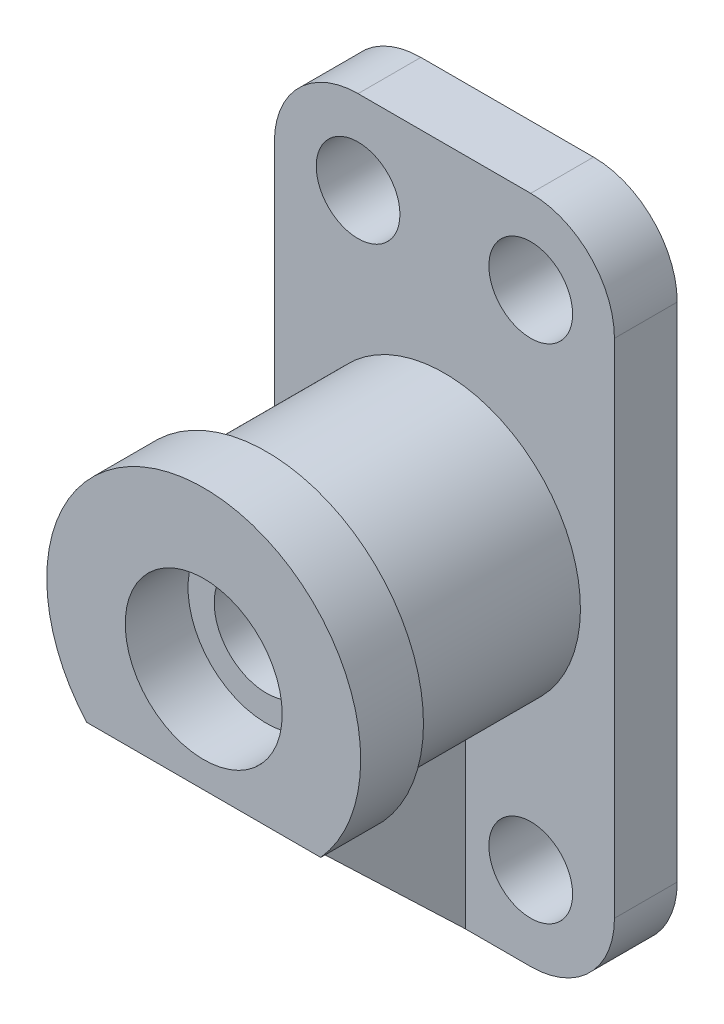
ISO-10303-21;
HEADER;
FILE_DESCRIPTION(('STEP AP214'),'2;1');
FILE_NAME('part.step','',(''),(''),'','','');
FILE_SCHEMA(('AUTOMOTIVE_DESIGN { 1 0 10303 214 1 1 1 1 }'));
ENDSEC;
DATA;
#1=APPLICATION_CONTEXT('core data for automotive mechanical design processes');
#2=APPLICATION_PROTOCOL_DEFINITION('international standard','automotive_design',2000,#1);
#3=PRODUCT_CONTEXT('',#1,'mechanical');
#4=PRODUCT('Part','Part','',(#3));
#5=PRODUCT_RELATED_PRODUCT_CATEGORY('part','',(#4));
#6=PRODUCT_DEFINITION_FORMATION('','',#4);
#7=PRODUCT_DEFINITION_CONTEXT('part definition',#1,'design');
#8=PRODUCT_DEFINITION('design','',#6,#7);
#9=PRODUCT_DEFINITION_SHAPE('','',#8);
#10=(LENGTH_UNIT() NAMED_UNIT(*) SI_UNIT(.MILLI.,.METRE.));
#11=(NAMED_UNIT(*) PLANE_ANGLE_UNIT() SI_UNIT($,.RADIAN.));
#12=(NAMED_UNIT(*) SI_UNIT($,.STERADIAN.) SOLID_ANGLE_UNIT());
#13=UNCERTAINTY_MEASURE_WITH_UNIT(LENGTH_MEASURE(1.E-05),#10,'distance_accuracy_value','');
#14=(GEOMETRIC_REPRESENTATION_CONTEXT(3) GLOBAL_UNCERTAINTY_ASSIGNED_CONTEXT((#13)) GLOBAL_UNIT_ASSIGNED_CONTEXT((#10,
#11,#12)) REPRESENTATION_CONTEXT('',''));
#15=CARTESIAN_POINT('',(0.,0.,0.));
#16=DIRECTION('',(0.,0.,1.));
#17=DIRECTION('',(1.,0.,0.));
#18=AXIS2_PLACEMENT_3D('',#15,#16,#17);
#19=CARTESIAN_POINT('',(-75.0284068949451,14.3133089873143,12.));
#20=DIRECTION('',(0.,1.,0.));
#21=DIRECTION('',(0.,0.,1.));
#22=AXIS2_PLACEMENT_3D('',#19,#20,#21);
#23=PLANE('',#22);
#24=DIRECTION('',(0.,0.,1.));
#25=VECTOR('',#24,1.);
#26=CARTESIAN_POINT('',(-48.6677271199472,14.3133089873143,12.));
#27=LINE('',#26,#25);
#28=CARTESIAN_POINT('',(-48.6677271199472,14.3133089873143,12.));
#29=VERTEX_POINT('',#28);
#30=CARTESIAN_POINT('',(-48.6677271199472,14.3133089873143,58.));
#31=VERTEX_POINT('',#30);
#32=EDGE_CURVE('E54',#29,#31,#27,.T.);
#33=ORIENTED_EDGE('',*,*,#32,.F.);
#34=DIRECTION('',(-1.,0.,0.));
#35=VECTOR('',#34,1.);
#36=CARTESIAN_POINT('',(-75.0284068949451,14.3133089873143,12.));
#37=LINE('',#36,#35);
#38=CARTESIAN_POINT('',(-36.0544793941111,14.3133089873143,12.));
#39=VERTEX_POINT('',#38);
#40=EDGE_CURVE('E194',#39,#29,#37,.T.);
#41=ORIENTED_EDGE('',*,*,#40,.F.);
#42=DIRECTION('',(0.,0.,-1.));
#43=VECTOR('',#42,1.);
#44=CARTESIAN_POINT('',(-36.0544793941111,14.3133089873143,46.));
#45=LINE('',#44,#43);
#46=CARTESIAN_POINT('',(-36.0544793941111,14.3133089873143,46.));
#47=VERTEX_POINT('',#46);
#48=EDGE_CURVE('E201',#47,#39,#45,.T.);
#49=ORIENTED_EDGE('',*,*,#48,.F.);
#50=DIRECTION('',(-1.,0.,0.));
#51=VECTOR('',#50,1.);
#52=CARTESIAN_POINT('',(-52.6677271199472,14.3133089873143,46.));
#53=LINE('',#52,#51);
#54=CARTESIAN_POINT('',(-30.3070473449493,14.3133089873143,46.));
#55=VERTEX_POINT('',#54);
#56=EDGE_CURVE('E196',#55,#47,#53,.T.);
#57=ORIENTED_EDGE('',*,*,#56,.F.);
#58=DIRECTION('',(0.,0.,-1.));
#59=VECTOR('',#58,1.);
#60=CARTESIAN_POINT('',(-30.3070473449493,14.3133089873143,58.));
#61=LINE('',#60,#59);
#62=CARTESIAN_POINT('',(-30.3070473449493,14.3133089873143,58.));
#63=VERTEX_POINT('',#62);
#64=EDGE_CURVE('E157',#63,#55,#61,.T.);
#65=ORIENTED_EDGE('',*,*,#64,.F.);
#66=DIRECTION('',(-1.,0.,0.));
#67=VECTOR('',#66,1.);
#68=CARTESIAN_POINT('',(-75.0284068949451,14.3133089873143,58.));
#69=LINE('',#68,#67);
#70=EDGE_CURVE('E153',#63,#31,#69,.T.);
#71=ORIENTED_EDGE('',*,*,#70,.T.);
#72=EDGE_LOOP('',(#33,#41,#49,#57,#65,#71));
#73=FACE_BOUND('',#72,.T.);
#74=ADVANCED_FACE('F45',(#73),#23,.F.);
#75=CARTESIAN_POINT('',(-52.6677271199472,34.3133089873143,46.));
#76=DIRECTION('',(0.,0.,1.));
#77=DIRECTION('',(1.,0.,0.));
#78=AXIS2_PLACEMENT_3D('',#75,#76,#77);
#79=PLANE('',#78);
#80=CARTESIAN_POINT('',(-52.6677271199472,34.3133089873143,46.));
#81=DIRECTION('',(0.,0.,1.));
#82=DIRECTION('',(1.,0.,0.));
#83=AXIS2_PLACEMENT_3D('',#80,#81,#82);
#84=CIRCLE('',#83,10.);
#85=CARTESIAN_POINT('',(-42.6677271199472,34.3133089873143,46.));
#86=VERTEX_POINT('',#85);
#87=EDGE_CURVE('E225',#86,#86,#84,.T.);
#88=ORIENTED_EDGE('',*,*,#87,.F.);
#89=EDGE_LOOP('',(#88));
#90=FACE_BOUND('',#89,.T.);
#91=CARTESIAN_POINT('',(-52.6677271199472,34.3133089873143,46.));
#92=DIRECTION('',(0.,0.,1.));
#93=DIRECTION('',(1.,0.,0.));
#94=AXIS2_PLACEMENT_3D('',#91,#92,#93);
#95=CIRCLE('',#94,15.);
#96=CARTESIAN_POINT('',(-37.6677271199472,34.3133089873143,46.));
#97=VERTEX_POINT('',#96);
#98=EDGE_CURVE('E210',#97,#97,#95,.T.);
#99=ORIENTED_EDGE('',*,*,#98,.T.);
#100=EDGE_LOOP('',(#99));
#101=FACE_BOUND('',#100,.T.);
#102=ADVANCED_FACE('F429',(#90,#101),#79,.T.);
#103=CARTESIAN_POINT('',(-69.1677271199472,82.3133089873143,12.));
#104=DIRECTION('',(0.,0.,1.));
#105=DIRECTION('',(1.,0.,0.));
#106=AXIS2_PLACEMENT_3D('',#103,#104,#105);
#107=PLANE('',#106);
#108=CARTESIAN_POINT('',(-56.6677271199472,14.3133089873143,12.));
#109=VERTEX_POINT('',#108);
#110=CARTESIAN_POINT('',(-69.2809748457834,14.3133089873143,12.));
#111=VERTEX_POINT('',#110);
#112=EDGE_CURVE('E161',#109,#111,#37,.T.);
#113=ORIENTED_EDGE('',*,*,#112,.T.);
#114=CARTESIAN_POINT('',(-52.6677271199472,34.3133089873143,12.));
#115=DIRECTION('',(0.,0.,1.));
#116=DIRECTION('',(1.,0.,0.));
#117=AXIS2_PLACEMENT_3D('',#114,#115,#116);
#118=CIRCLE('',#117,26.);
#119=EDGE_CURVE('E229',#39,#111,#118,.T.);
#120=ORIENTED_EDGE('',*,*,#119,.F.);
#121=ORIENTED_EDGE('',*,*,#40,.T.);
#122=DIRECTION('',(0.,-1.,0.));
#123=VECTOR('',#122,1.);
#124=CARTESIAN_POINT('',(-48.6677271199472,82.3133089873143,12.));
#125=LINE('',#124,#123);
#126=CARTESIAN_POINT('',(-48.6677271199472,-29.6866910126857,12.));
#127=VERTEX_POINT('',#126);
#128=EDGE_CURVE('E61',#29,#127,#125,.T.);
#129=ORIENTED_EDGE('',*,*,#128,.T.);
#130=DIRECTION('',(1.,0.,0.));
#131=VECTOR('',#130,1.);
#132=CARTESIAN_POINT('',(-36.1677271199472,-29.6866910126856,12.));
#133=LINE('',#132,#131);
#134=CARTESIAN_POINT('',(-36.1677271199472,-29.6866910126856,12.));
#135=VERTEX_POINT('',#134);
#136=EDGE_CURVE('E279',#127,#135,#133,.T.);
#137=ORIENTED_EDGE('',*,*,#136,.T.);
#138=CARTESIAN_POINT('',(-36.1677271199472,-13.6866910126856,12.));
#139=DIRECTION('',(0.,0.,1.));
#140=DIRECTION('',(1.,0.,0.));
#141=AXIS2_PLACEMENT_3D('',#138,#139,#140);
#142=CIRCLE('',#141,16.);
#143=CARTESIAN_POINT('',(-20.1677271199472,-13.6866910126856,12.));
#144=VERTEX_POINT('',#143);
#145=EDGE_CURVE('E283',#135,#144,#142,.T.);
#146=ORIENTED_EDGE('',*,*,#145,.T.);
#147=DIRECTION('',(0.,1.,0.));
#148=VECTOR('',#147,1.);
#149=CARTESIAN_POINT('',(-20.1677271199472,82.3133089873143,12.));
#150=LINE('',#149,#148);
#151=CARTESIAN_POINT('',(-20.1677271199472,82.3133089873143,12.));
#152=VERTEX_POINT('',#151);
#153=EDGE_CURVE('E286',#144,#152,#150,.T.);
#154=ORIENTED_EDGE('',*,*,#153,.T.);
#155=CARTESIAN_POINT('',(-36.1677271199472,82.3133089873143,12.));
#156=DIRECTION('',(0.,0.,1.));
#157=DIRECTION('',(1.,0.,0.));
#158=AXIS2_PLACEMENT_3D('',#155,#156,#157);
#159=CIRCLE('',#158,16.);
#160=CARTESIAN_POINT('',(-36.1677271199472,98.3133089873143,12.));
#161=VERTEX_POINT('',#160);
#162=EDGE_CURVE('E289',#152,#161,#159,.T.);
#163=ORIENTED_EDGE('',*,*,#162,.T.);
#164=DIRECTION('',(-1.,0.,0.));
#165=VECTOR('',#164,1.);
#166=CARTESIAN_POINT('',(-69.1677271199472,98.3133089873143,12.));
#167=LINE('',#166,#165);
#168=CARTESIAN_POINT('',(-69.1677271199472,98.3133089873143,12.));
#169=VERTEX_POINT('',#168);
#170=EDGE_CURVE('E292',#161,#169,#167,.T.);
#171=ORIENTED_EDGE('',*,*,#170,.T.);
#172=CARTESIAN_POINT('',(-69.1677271199472,82.3133089873143,12.));
#173=DIRECTION('',(0.,0.,1.));
#174=DIRECTION('',(1.,0.,0.));
#175=AXIS2_PLACEMENT_3D('',#172,#173,#174);
#176=CIRCLE('',#175,16.);
#177=CARTESIAN_POINT('',(-85.1677271199472,82.3133089873143,12.));
#178=VERTEX_POINT('',#177);
#179=EDGE_CURVE('E268',#169,#178,#176,.T.);
#180=ORIENTED_EDGE('',*,*,#179,.T.);
#181=DIRECTION('',(0.,-1.,0.));
#182=VECTOR('',#181,1.);
#183=CARTESIAN_POINT('',(-85.1677271199472,82.3133089873143,12.));
#184=LINE('',#183,#182);
#185=CARTESIAN_POINT('',(-85.1677271199472,-13.6866910126857,12.));
#186=VERTEX_POINT('',#185);
#187=EDGE_CURVE('E272',#178,#186,#184,.T.);
#188=ORIENTED_EDGE('',*,*,#187,.T.);
#189=CARTESIAN_POINT('',(-69.1677271199472,-13.6866910126857,12.));
#190=DIRECTION('',(0.,0.,1.));
#191=DIRECTION('',(1.,0.,0.));
#192=AXIS2_PLACEMENT_3D('',#189,#190,#191);
#193=CIRCLE('',#192,16.);
#194=CARTESIAN_POINT('',(-69.1677271199472,-29.6866910126857,12.));
#195=VERTEX_POINT('',#194);
#196=EDGE_CURVE('E276',#186,#195,#193,.T.);
#197=ORIENTED_EDGE('',*,*,#196,.T.);
#198=CARTESIAN_POINT('',(-56.6677271199472,-29.6866910126857,12.));
#199=VERTEX_POINT('',#198);
#200=EDGE_CURVE('E280',#195,#199,#133,.T.);
#201=ORIENTED_EDGE('',*,*,#200,.T.);
#202=DIRECTION('',(0.,-1.,0.));
#203=VECTOR('',#202,1.);
#204=CARTESIAN_POINT('',(-56.6677271199472,82.3133089873143,12.));
#205=LINE('',#204,#203);
#206=EDGE_CURVE('E188',#109,#199,#205,.T.);
#207=ORIENTED_EDGE('',*,*,#206,.F.);
#208=EDGE_LOOP('',(#113,#120,#121,#129,#137,#146,#154,#163,#171,#180,#188,#197,#201,#207));
#209=FACE_BOUND('',#208,.T.);
#210=CARTESIAN_POINT('',(-69.1677271199472,-13.6866910126857,12.));
#211=DIRECTION('',(0.,0.,1.));
#212=DIRECTION('',(1.,0.,0.));
#213=AXIS2_PLACEMENT_3D('',#210,#211,#212);
#214=CIRCLE('',#213,8.);
#215=CARTESIAN_POINT('',(-61.1677271199472,-13.6866910126857,12.));
#216=VERTEX_POINT('',#215);
#217=EDGE_CURVE('E244',#216,#216,#214,.T.);
#218=ORIENTED_EDGE('',*,*,#217,.F.);
#219=EDGE_LOOP('',(#218));
#220=FACE_BOUND('',#219,.T.);
#221=CARTESIAN_POINT('',(-69.1677271199472,82.3133089873143,12.));
#222=DIRECTION('',(0.,0.,1.));
#223=DIRECTION('',(1.,0.,0.));
#224=AXIS2_PLACEMENT_3D('',#221,#222,#223);
#225=CIRCLE('',#224,8.);
#226=CARTESIAN_POINT('',(-61.1677271199472,82.3133089873143,12.));
#227=VERTEX_POINT('',#226);
#228=EDGE_CURVE('E260',#227,#227,#225,.T.);
#229=ORIENTED_EDGE('',*,*,#228,.F.);
#230=EDGE_LOOP('',(#229));
#231=FACE_BOUND('',#230,.T.);
#232=CARTESIAN_POINT('',(-36.1677271199472,-13.6866910126856,12.));
#233=DIRECTION('',(0.,0.,1.));
#234=DIRECTION('',(1.,0.,0.));
#235=AXIS2_PLACEMENT_3D('',#232,#233,#234);
#236=CIRCLE('',#235,8.);
#237=CARTESIAN_POINT('',(-28.1677271199472,-13.6866910126856,12.));
#238=VERTEX_POINT('',#237);
#239=EDGE_CURVE('E236',#238,#238,#236,.T.);
#240=ORIENTED_EDGE('',*,*,#239,.F.);
#241=EDGE_LOOP('',(#240));
#242=FACE_BOUND('',#241,.T.);
#243=CARTESIAN_POINT('',(-36.1677271199472,82.3133089873143,12.));
#244=DIRECTION('',(0.,0.,1.));
#245=DIRECTION('',(1.,0.,0.));
#246=AXIS2_PLACEMENT_3D('',#243,#244,#245);
#247=CIRCLE('',#246,8.);
#248=CARTESIAN_POINT('',(-28.1677271199472,82.3133089873143,12.));
#249=VERTEX_POINT('',#248);
#250=EDGE_CURVE('E252',#249,#249,#247,.T.);
#251=ORIENTED_EDGE('',*,*,#250,.F.);
#252=EDGE_LOOP('',(#251));
#253=FACE_BOUND('',#252,.T.);
#254=ADVANCED_FACE('F378',(#209,#220,#231,#242,#253),#107,.T.);
#255=CARTESIAN_POINT('',(-69.1677271199472,82.3133089873143,0.));
#256=DIRECTION('',(0.,0.,1.));
#257=DIRECTION('',(1.,0.,0.));
#258=AXIS2_PLACEMENT_3D('',#255,#256,#257);
#259=PLANE('',#258);
#260=CARTESIAN_POINT('',(-52.6677271199472,34.3133089873143,0.));
#261=DIRECTION('',(0.,0.,1.));
#262=DIRECTION('',(1.,0.,0.));
#263=AXIS2_PLACEMENT_3D('',#260,#261,#262);
#264=CIRCLE('',#263,10.);
#265=CARTESIAN_POINT('',(-42.6677271199472,34.3133089873143,0.));
#266=VERTEX_POINT('',#265);
#267=EDGE_CURVE('E222',#266,#266,#264,.T.);
#268=ORIENTED_EDGE('',*,*,#267,.T.);
#269=EDGE_LOOP('',(#268));
#270=FACE_BOUND('',#269,.T.);
#271=CARTESIAN_POINT('',(-69.1677271199472,82.3133089873143,0.));
#272=DIRECTION('',(0.,0.,1.));
#273=DIRECTION('',(1.,0.,0.));
#274=AXIS2_PLACEMENT_3D('',#271,#272,#273);
#275=CIRCLE('',#274,16.);
#276=CARTESIAN_POINT('',(-69.1677271199472,98.3133089873143,0.));
#277=VERTEX_POINT('',#276);
#278=CARTESIAN_POINT('',(-85.1677271199472,82.3133089873143,0.));
#279=VERTEX_POINT('',#278);
#280=EDGE_CURVE('E264',#277,#279,#275,.T.);
#281=ORIENTED_EDGE('',*,*,#280,.F.);
#282=DIRECTION('',(-1.,0.,0.));
#283=VECTOR('',#282,1.);
#284=CARTESIAN_POINT('',(-69.1677271199472,98.3133089873143,0.));
#285=LINE('',#284,#283);
#286=CARTESIAN_POINT('',(-36.1677271199472,98.3133089873143,0.));
#287=VERTEX_POINT('',#286);
#288=EDGE_CURVE('E273',#287,#277,#285,.T.);
#289=ORIENTED_EDGE('',*,*,#288,.F.);
#290=CARTESIAN_POINT('',(-36.1677271199472,82.3133089873143,0.));
#291=DIRECTION('',(0.,0.,1.));
#292=DIRECTION('',(1.,0.,0.));
#293=AXIS2_PLACEMENT_3D('',#290,#291,#292);
#294=CIRCLE('',#293,16.);
#295=CARTESIAN_POINT('',(-20.1677271199472,82.3133089873143,0.));
#296=VERTEX_POINT('',#295);
#297=EDGE_CURVE('E314',#296,#287,#294,.T.);
#298=ORIENTED_EDGE('',*,*,#297,.F.);
#299=DIRECTION('',(0.,1.,0.));
#300=VECTOR('',#299,1.);
#301=CARTESIAN_POINT('',(-20.1677271199472,82.3133089873143,0.));
#302=LINE('',#301,#300);
#303=CARTESIAN_POINT('',(-20.1677271199472,-13.6866910126856,0.));
#304=VERTEX_POINT('',#303);
#305=EDGE_CURVE('E311',#304,#296,#302,.T.);
#306=ORIENTED_EDGE('',*,*,#305,.F.);
#307=CARTESIAN_POINT('',(-36.1677271199472,-13.6866910126856,0.));
#308=DIRECTION('',(0.,0.,1.));
#309=DIRECTION('',(1.,0.,0.));
#310=AXIS2_PLACEMENT_3D('',#307,#308,#309);
#311=CIRCLE('',#310,16.);
#312=CARTESIAN_POINT('',(-36.1677271199472,-29.6866910126856,0.));
#313=VERTEX_POINT('',#312);
#314=EDGE_CURVE('E308',#313,#304,#311,.T.);
#315=ORIENTED_EDGE('',*,*,#314,.F.);
#316=DIRECTION('',(1.,0.,0.));
#317=VECTOR('',#316,1.);
#318=CARTESIAN_POINT('',(-36.1677271199472,-29.6866910126856,0.));
#319=LINE('',#318,#317);
#320=CARTESIAN_POINT('',(-69.1677271199472,-29.6866910126857,0.));
#321=VERTEX_POINT('',#320);
#322=EDGE_CURVE('E305',#321,#313,#319,.T.);
#323=ORIENTED_EDGE('',*,*,#322,.F.);
#324=CARTESIAN_POINT('',(-69.1677271199472,-13.6866910126857,0.));
#325=DIRECTION('',(0.,0.,1.));
#326=DIRECTION('',(1.,0.,0.));
#327=AXIS2_PLACEMENT_3D('',#324,#325,#326);
#328=CIRCLE('',#327,16.);
#329=CARTESIAN_POINT('',(-85.1677271199472,-13.6866910126857,0.));
#330=VERTEX_POINT('',#329);
#331=EDGE_CURVE('E302',#330,#321,#328,.T.);
#332=ORIENTED_EDGE('',*,*,#331,.F.);
#333=DIRECTION('',(0.,-1.,0.));
#334=VECTOR('',#333,1.);
#335=CARTESIAN_POINT('',(-85.1677271199472,82.3133089873143,0.));
#336=LINE('',#335,#334);
#337=EDGE_CURVE('E299',#279,#330,#336,.T.);
#338=ORIENTED_EDGE('',*,*,#337,.F.);
#339=EDGE_LOOP('',(#281,#289,#298,#306,#315,#323,#332,#338));
#340=FACE_BOUND('',#339,.T.);
#341=CARTESIAN_POINT('',(-69.1677271199472,82.3133089873143,0.));
#342=DIRECTION('',(0.,0.,1.));
#343=DIRECTION('',(1.,0.,0.));
#344=AXIS2_PLACEMENT_3D('',#341,#342,#343);
#345=CIRCLE('',#344,8.);
#346=CARTESIAN_POINT('',(-61.1677271199472,82.3133089873143,0.));
#347=VERTEX_POINT('',#346);
#348=EDGE_CURVE('E256',#347,#347,#345,.T.);
#349=ORIENTED_EDGE('',*,*,#348,.T.);
#350=EDGE_LOOP('',(#349));
#351=FACE_BOUND('',#350,.T.);
#352=CARTESIAN_POINT('',(-69.1677271199472,-13.6866910126857,0.));
#353=DIRECTION('',(0.,0.,1.));
#354=DIRECTION('',(1.,0.,0.));
#355=AXIS2_PLACEMENT_3D('',#352,#353,#354);
#356=CIRCLE('',#355,8.);
#357=CARTESIAN_POINT('',(-61.1677271199472,-13.6866910126857,0.));
#358=VERTEX_POINT('',#357);
#359=EDGE_CURVE('E240',#358,#358,#356,.T.);
#360=ORIENTED_EDGE('',*,*,#359,.T.);
#361=EDGE_LOOP('',(#360));
#362=FACE_BOUND('',#361,.T.);
#363=CARTESIAN_POINT('',(-36.1677271199472,-13.6866910126856,0.));
#364=DIRECTION('',(0.,0.,1.));
#365=DIRECTION('',(1.,0.,0.));
#366=AXIS2_PLACEMENT_3D('',#363,#364,#365);
#367=CIRCLE('',#366,8.);
#368=CARTESIAN_POINT('',(-28.1677271199472,-13.6866910126856,0.));
#369=VERTEX_POINT('',#368);
#370=EDGE_CURVE('E233',#369,#369,#367,.T.);
#371=ORIENTED_EDGE('',*,*,#370,.T.);
#372=EDGE_LOOP('',(#371));
#373=FACE_BOUND('',#372,.T.);
#374=CARTESIAN_POINT('',(-36.1677271199472,82.3133089873143,0.));
#375=DIRECTION('',(0.,0.,1.));
#376=DIRECTION('',(1.,0.,0.));
#377=AXIS2_PLACEMENT_3D('',#374,#375,#376);
#378=CIRCLE('',#377,8.);
#379=CARTESIAN_POINT('',(-28.1677271199472,82.3133089873143,0.));
#380=VERTEX_POINT('',#379);
#381=EDGE_CURVE('E248',#380,#380,#378,.T.);
#382=ORIENTED_EDGE('',*,*,#381,.T.);
#383=EDGE_LOOP('',(#382));
#384=FACE_BOUND('',#383,.T.);
#385=ADVANCED_FACE('F391',(#270,#340,#351,#362,#373,#384),#259,.F.);
#386=CARTESIAN_POINT('',(-69.1677271199472,82.3133089873143,12.));
#387=DIRECTION('',(0.,0.,-1.));
#388=DIRECTION('',(-1.,0.,0.));
#389=AXIS2_PLACEMENT_3D('',#386,#387,#388);
#390=CYLINDRICAL_SURFACE('',#389,16.);
#391=ORIENTED_EDGE('',*,*,#280,.T.);
#392=DIRECTION('',(0.,0.,-1.));
#393=VECTOR('',#392,1.);
#394=CARTESIAN_POINT('',(-85.1677271199472,82.3133089873143,12.));
#395=LINE('',#394,#393);
#396=EDGE_CURVE('E346',#178,#279,#395,.T.);
#397=ORIENTED_EDGE('',*,*,#396,.F.);
#398=ORIENTED_EDGE('',*,*,#179,.F.);
#399=DIRECTION('',(0.,0.,-1.));
#400=VECTOR('',#399,1.);
#401=CARTESIAN_POINT('',(-69.1677271199472,98.3133089873143,12.));
#402=LINE('',#401,#400);
#403=EDGE_CURVE('E295',#169,#277,#402,.T.);
#404=ORIENTED_EDGE('',*,*,#403,.T.);
#405=EDGE_LOOP('',(#391,#397,#398,#404));
#406=FACE_BOUND('',#405,.T.);
#407=ADVANCED_FACE('F47',(#406),#390,.T.);
#408=CARTESIAN_POINT('',(-85.1677271199472,82.3133089873143,12.));
#409=DIRECTION('',(1.,0.,0.));
#410=DIRECTION('',(0.,0.,-1.));
#411=AXIS2_PLACEMENT_3D('',#408,#409,#410);
#412=PLANE('',#411);
#413=ORIENTED_EDGE('',*,*,#337,.T.);
#414=DIRECTION('',(0.,0.,-1.));
#415=VECTOR('',#414,1.);
#416=CARTESIAN_POINT('',(-85.1677271199472,-13.6866910126857,12.));
#417=LINE('',#416,#415);
#418=EDGE_CURVE('E342',#186,#330,#417,.T.);
#419=ORIENTED_EDGE('',*,*,#418,.F.);
#420=ORIENTED_EDGE('',*,*,#187,.F.);
#421=ORIENTED_EDGE('',*,*,#396,.T.);
#422=EDGE_LOOP('',(#413,#419,#420,#421));
#423=FACE_BOUND('',#422,.T.);
#424=ADVANCED_FACE('F418',(#423),#412,.F.);
#425=CARTESIAN_POINT('',(-69.1677271199472,-13.6866910126857,12.));
#426=DIRECTION('',(0.,0.,-1.));
#427=DIRECTION('',(-1.,0.,0.));
#428=AXIS2_PLACEMENT_3D('',#425,#426,#427);
#429=CYLINDRICAL_SURFACE('',#428,16.);
#430=ORIENTED_EDGE('',*,*,#331,.T.);
#431=DIRECTION('',(0.,0.,-1.));
#432=VECTOR('',#431,1.);
#433=CARTESIAN_POINT('',(-69.1677271199472,-29.6866910126857,12.));
#434=LINE('',#433,#432);
#435=EDGE_CURVE('E338',#195,#321,#434,.T.);
#436=ORIENTED_EDGE('',*,*,#435,.F.);
#437=ORIENTED_EDGE('',*,*,#196,.F.);
#438=ORIENTED_EDGE('',*,*,#418,.T.);
#439=EDGE_LOOP('',(#430,#436,#437,#438));
#440=FACE_BOUND('',#439,.T.);
#441=ADVANCED_FACE('F419',(#440),#429,.T.);
#442=CARTESIAN_POINT('',(-36.1677271199472,-29.6866910126856,12.));
#443=DIRECTION('',(0.,1.,0.));
#444=DIRECTION('',(-1.,0.,0.));
#445=AXIS2_PLACEMENT_3D('',#442,#443,#444);
#446=PLANE('',#445);
#447=ORIENTED_EDGE('',*,*,#322,.T.);
#448=DIRECTION('',(0.,0.,-1.));
#449=VECTOR('',#448,1.);
#450=CARTESIAN_POINT('',(-36.1677271199472,-29.6866910126856,12.));
#451=LINE('',#450,#449);
#452=EDGE_CURVE('E334',#135,#313,#451,.T.);
#453=ORIENTED_EDGE('',*,*,#452,.F.);
#454=ORIENTED_EDGE('',*,*,#136,.F.);
#455=DIRECTION('',(-1.,0.,0.));
#456=VECTOR('',#455,1.);
#457=CARTESIAN_POINT('',(-36.1677271199472,-29.6866910126856,12.));
#458=LINE('',#457,#456);
#459=EDGE_CURVE('E68',#199,#127,#458,.F.);
#460=ORIENTED_EDGE('',*,*,#459,.F.);
#461=ORIENTED_EDGE('',*,*,#200,.F.);
#462=ORIENTED_EDGE('',*,*,#435,.T.);
#463=EDGE_LOOP('',(#447,#453,#454,#460,#461,#462));
#464=FACE_BOUND('',#463,.T.);
#465=ADVANCED_FACE('F383',(#464),#446,.F.);
#466=CARTESIAN_POINT('',(-36.1677271199472,-13.6866910126856,12.));
#467=DIRECTION('',(0.,0.,-1.));
#468=DIRECTION('',(-1.,0.,0.));
#469=AXIS2_PLACEMENT_3D('',#466,#467,#468);
#470=CYLINDRICAL_SURFACE('',#469,16.);
#471=ORIENTED_EDGE('',*,*,#314,.T.);
#472=DIRECTION('',(0.,0.,-1.));
#473=VECTOR('',#472,1.);
#474=CARTESIAN_POINT('',(-20.1677271199472,-13.6866910126856,12.));
#475=LINE('',#474,#473);
#476=EDGE_CURVE('E330',#144,#304,#475,.T.);
#477=ORIENTED_EDGE('',*,*,#476,.F.);
#478=ORIENTED_EDGE('',*,*,#145,.F.);
#479=ORIENTED_EDGE('',*,*,#452,.T.);
#480=EDGE_LOOP('',(#471,#477,#478,#479));
#481=FACE_BOUND('',#480,.T.);
#482=ADVANCED_FACE('F397',(#481),#470,.T.);
#483=CARTESIAN_POINT('',(-20.1677271199472,82.3133089873143,12.));
#484=DIRECTION('',(-1.,0.,0.));
#485=DIRECTION('',(0.,0.,1.));
#486=AXIS2_PLACEMENT_3D('',#483,#484,#485);
#487=PLANE('',#486);
#488=ORIENTED_EDGE('',*,*,#305,.T.);
#489=DIRECTION('',(0.,0.,-1.));
#490=VECTOR('',#489,1.);
#491=CARTESIAN_POINT('',(-20.1677271199472,82.3133089873143,12.));
#492=LINE('',#491,#490);
#493=EDGE_CURVE('E326',#152,#296,#492,.T.);
#494=ORIENTED_EDGE('',*,*,#493,.F.);
#495=ORIENTED_EDGE('',*,*,#153,.F.);
#496=ORIENTED_EDGE('',*,*,#476,.T.);
#497=EDGE_LOOP('',(#488,#494,#495,#496));
#498=FACE_BOUND('',#497,.T.);
#499=ADVANCED_FACE('F401',(#498),#487,.F.);
#500=CARTESIAN_POINT('',(-36.1677271199472,82.3133089873143,12.));
#501=DIRECTION('',(0.,0.,-1.));
#502=DIRECTION('',(-1.,0.,0.));
#503=AXIS2_PLACEMENT_3D('',#500,#501,#502);
#504=CYLINDRICAL_SURFACE('',#503,16.);
#505=ORIENTED_EDGE('',*,*,#297,.T.);
#506=DIRECTION('',(0.,0.,-1.));
#507=VECTOR('',#506,1.);
#508=CARTESIAN_POINT('',(-36.1677271199472,98.3133089873143,12.));
#509=LINE('',#508,#507);
#510=EDGE_CURVE('E322',#161,#287,#509,.T.);
#511=ORIENTED_EDGE('',*,*,#510,.F.);
#512=ORIENTED_EDGE('',*,*,#162,.F.);
#513=ORIENTED_EDGE('',*,*,#493,.T.);
#514=EDGE_LOOP('',(#505,#511,#512,#513));
#515=FACE_BOUND('',#514,.T.);
#516=ADVANCED_FACE('F409',(#515),#504,.T.);
#517=CARTESIAN_POINT('',(-69.1677271199472,98.3133089873143,12.));
#518=DIRECTION('',(0.,-1.,0.));
#519=DIRECTION('',(0.,0.,-1.));
#520=AXIS2_PLACEMENT_3D('',#517,#518,#519);
#521=PLANE('',#520);
#522=ORIENTED_EDGE('',*,*,#403,.F.);
#523=ORIENTED_EDGE('',*,*,#170,.F.);
#524=ORIENTED_EDGE('',*,*,#510,.T.);
#525=ORIENTED_EDGE('',*,*,#288,.T.);
#526=EDGE_LOOP('',(#522,#523,#524,#525));
#527=FACE_BOUND('',#526,.T.);
#528=ADVANCED_FACE('F412',(#527),#521,.F.);
#529=CARTESIAN_POINT('',(-69.1677271199472,82.3133089873143,12.));
#530=DIRECTION('',(0.,0.,-1.));
#531=DIRECTION('',(-1.,0.,0.));
#532=AXIS2_PLACEMENT_3D('',#529,#530,#531);
#533=CYLINDRICAL_SURFACE('',#532,8.);
#534=ORIENTED_EDGE('',*,*,#228,.T.);
#535=EDGE_LOOP('',(#534));
#536=FACE_BOUND('',#535,.T.);
#537=ORIENTED_EDGE('',*,*,#348,.F.);
#538=EDGE_LOOP('',(#537));
#539=FACE_BOUND('',#538,.T.);
#540=ADVANCED_FACE('F476',(#536,#539),#533,.F.);
#541=CARTESIAN_POINT('',(-36.1677271199472,82.3133089873143,12.));
#542=DIRECTION('',(0.,0.,-1.));
#543=DIRECTION('',(-1.,0.,0.));
#544=AXIS2_PLACEMENT_3D('',#541,#542,#543);
#545=CYLINDRICAL_SURFACE('',#544,8.);
#546=ORIENTED_EDGE('',*,*,#250,.T.);
#547=EDGE_LOOP('',(#546));
#548=FACE_BOUND('',#547,.T.);
#549=ORIENTED_EDGE('',*,*,#381,.F.);
#550=EDGE_LOOP('',(#549));
#551=FACE_BOUND('',#550,.T.);
#552=ADVANCED_FACE('F472',(#548,#551),#545,.F.);
#553=CARTESIAN_POINT('',(-69.1677271199472,-13.6866910126857,12.));
#554=DIRECTION('',(0.,0.,-1.));
#555=DIRECTION('',(-1.,0.,0.));
#556=AXIS2_PLACEMENT_3D('',#553,#554,#555);
#557=CYLINDRICAL_SURFACE('',#556,8.);
#558=ORIENTED_EDGE('',*,*,#217,.T.);
#559=EDGE_LOOP('',(#558));
#560=FACE_BOUND('',#559,.T.);
#561=ORIENTED_EDGE('',*,*,#359,.F.);
#562=EDGE_LOOP('',(#561));
#563=FACE_BOUND('',#562,.T.);
#564=ADVANCED_FACE('F468',(#560,#563),#557,.F.);
#565=CARTESIAN_POINT('',(-36.1677271199472,-13.6866910126856,12.));
#566=DIRECTION('',(0.,0.,-1.));
#567=DIRECTION('',(-1.,0.,0.));
#568=AXIS2_PLACEMENT_3D('',#565,#566,#567);
#569=CYLINDRICAL_SURFACE('',#568,8.);
#570=ORIENTED_EDGE('',*,*,#239,.T.);
#571=EDGE_LOOP('',(#570));
#572=FACE_BOUND('',#571,.T.);
#573=ORIENTED_EDGE('',*,*,#370,.F.);
#574=EDGE_LOOP('',(#573));
#575=FACE_BOUND('',#574,.T.);
#576=ADVANCED_FACE('F465',(#572,#575),#569,.F.);
#577=CARTESIAN_POINT('',(-52.6677271199472,34.3133089873143,46.));
#578=DIRECTION('',(0.,0.,-1.));
#579=DIRECTION('',(-1.,0.,0.));
#580=AXIS2_PLACEMENT_3D('',#577,#578,#579);
#581=CYLINDRICAL_SURFACE('',#580,26.);
#582=DIRECTION('',(0.,0.,-1.));
#583=VECTOR('',#582,1.);
#584=CARTESIAN_POINT('',(-69.2809748457834,14.3133089873143,46.));
#585=LINE('',#584,#583);
#586=CARTESIAN_POINT('',(-69.2809748457834,14.3133089873143,46.));
#587=VERTEX_POINT('',#586);
#588=EDGE_CURVE('E206',#111,#587,#585,.F.);
#589=ORIENTED_EDGE('',*,*,#588,.T.);
#590=CARTESIAN_POINT('',(-52.6677271199472,34.3133089873143,46.));
#591=DIRECTION('',(0.,0.,1.));
#592=DIRECTION('',(1.,0.,0.));
#593=AXIS2_PLACEMENT_3D('',#590,#591,#592);
#594=CIRCLE('',#593,26.);
#595=EDGE_CURVE('E230',#47,#587,#594,.T.);
#596=ORIENTED_EDGE('',*,*,#595,.F.);
#597=ORIENTED_EDGE('',*,*,#48,.T.);
#598=ORIENTED_EDGE('',*,*,#119,.T.);
#599=EDGE_LOOP('',(#589,#596,#597,#598));
#600=FACE_BOUND('',#599,.T.);
#601=ADVANCED_FACE('F460',(#600),#581,.T.);
#602=CARTESIAN_POINT('',(-52.6677271199472,34.3133089873143,46.));
#603=DIRECTION('',(0.,0.,-1.));
#604=DIRECTION('',(-1.,0.,0.));
#605=AXIS2_PLACEMENT_3D('',#602,#603,#604);
#606=CYLINDRICAL_SURFACE('',#605,10.);
#607=ORIENTED_EDGE('',*,*,#267,.F.);
#608=EDGE_LOOP('',(#607));
#609=FACE_BOUND('',#608,.T.);
#610=ORIENTED_EDGE('',*,*,#87,.T.);
#611=EDGE_LOOP('',(#610));
#612=FACE_BOUND('',#611,.T.);
#613=ADVANCED_FACE('F457',(#609,#612),#606,.F.);
#614=CARTESIAN_POINT('',(-52.6677271199472,34.3133089873143,46.));
#615=DIRECTION('',(0.,0.,1.));
#616=DIRECTION('',(1.,0.,0.));
#617=AXIS2_PLACEMENT_3D('',#614,#615,#616);
#618=PLANE('',#617);
#619=CARTESIAN_POINT('',(-75.0284068949451,14.3133089873143,46.));
#620=VERTEX_POINT('',#619);
#621=EDGE_CURVE('E202',#587,#620,#53,.T.);
#622=ORIENTED_EDGE('',*,*,#621,.T.);
#623=CARTESIAN_POINT('',(-52.6677271199472,34.3133089873143,46.));
#624=DIRECTION('',(0.,0.,1.));
#625=DIRECTION('',(1.,0.,0.));
#626=AXIS2_PLACEMENT_3D('',#623,#624,#625);
#627=CIRCLE('',#626,30.);
#628=EDGE_CURVE('E215',#55,#620,#627,.T.);
#629=ORIENTED_EDGE('',*,*,#628,.F.);
#630=ORIENTED_EDGE('',*,*,#56,.T.);
#631=ORIENTED_EDGE('',*,*,#595,.T.);
#632=EDGE_LOOP('',(#622,#629,#630,#631));
#633=FACE_BOUND('',#632,.T.);
#634=ADVANCED_FACE('F364',(#633),#618,.F.);
#635=CARTESIAN_POINT('',(-52.6677271199472,34.3133089873143,58.));
#636=DIRECTION('',(0.,0.,1.));
#637=DIRECTION('',(1.,0.,0.));
#638=AXIS2_PLACEMENT_3D('',#635,#636,#637);
#639=PLANE('',#638);
#640=CARTESIAN_POINT('',(-52.6677271199472,34.3133089873143,58.));
#641=DIRECTION('',(0.,0.,1.));
#642=DIRECTION('',(1.,0.,0.));
#643=AXIS2_PLACEMENT_3D('',#640,#641,#642);
#644=CIRCLE('',#643,15.);
#645=CARTESIAN_POINT('',(-37.6677271199472,34.3133089873143,58.));
#646=VERTEX_POINT('',#645);
#647=EDGE_CURVE('E211',#646,#646,#644,.T.);
#648=ORIENTED_EDGE('',*,*,#647,.F.);
#649=EDGE_LOOP('',(#648));
#650=FACE_BOUND('',#649,.T.);
#651=CARTESIAN_POINT('',(-52.6677271199472,34.3133089873143,58.));
#652=DIRECTION('',(0.,0.,1.));
#653=DIRECTION('',(1.,0.,0.));
#654=AXIS2_PLACEMENT_3D('',#651,#652,#653);
#655=CIRCLE('',#654,30.);
#656=CARTESIAN_POINT('',(-75.0284068949451,14.3133089873143,58.));
#657=VERTEX_POINT('',#656);
#658=EDGE_CURVE('E219',#63,#657,#655,.T.);
#659=ORIENTED_EDGE('',*,*,#658,.T.);
#660=CARTESIAN_POINT('',(-56.6677271199472,14.3133089873143,58.));
#661=VERTEX_POINT('',#660);
#662=EDGE_CURVE('E164',#661,#657,#69,.T.);
#663=ORIENTED_EDGE('',*,*,#662,.F.);
#664=EDGE_CURVE('E162',#31,#661,#69,.T.);
#665=ORIENTED_EDGE('',*,*,#664,.F.);
#666=ORIENTED_EDGE('',*,*,#70,.F.);
#667=EDGE_LOOP('',(#659,#663,#665,#666));
#668=FACE_BOUND('',#667,.T.);
#669=ADVANCED_FACE('F167',(#650,#668),#639,.T.);
#670=CARTESIAN_POINT('',(-52.6677271199472,34.3133089873143,58.));
#671=DIRECTION('',(0.,0.,-1.));
#672=DIRECTION('',(-1.,0.,0.));
#673=AXIS2_PLACEMENT_3D('',#670,#671,#672);
#674=CYLINDRICAL_SURFACE('',#673,30.);
#675=DIRECTION('',(0.,0.,-1.));
#676=VECTOR('',#675,1.);
#677=CARTESIAN_POINT('',(-75.0284068949451,14.3133089873143,58.));
#678=LINE('',#677,#676);
#679=EDGE_CURVE('E350',#620,#657,#678,.F.);
#680=ORIENTED_EDGE('',*,*,#679,.T.);
#681=ORIENTED_EDGE('',*,*,#658,.F.);
#682=ORIENTED_EDGE('',*,*,#64,.T.);
#683=ORIENTED_EDGE('',*,*,#628,.T.);
#684=EDGE_LOOP('',(#680,#681,#682,#683));
#685=FACE_BOUND('',#684,.T.);
#686=ADVANCED_FACE('F360',(#685),#674,.T.);
#687=CARTESIAN_POINT('',(-52.6677271199472,34.3133089873143,58.));
#688=DIRECTION('',(0.,0.,-1.));
#689=DIRECTION('',(-1.,0.,0.));
#690=AXIS2_PLACEMENT_3D('',#687,#688,#689);
#691=CYLINDRICAL_SURFACE('',#690,15.);
#692=ORIENTED_EDGE('',*,*,#98,.F.);
#693=EDGE_LOOP('',(#692));
#694=FACE_BOUND('',#693,.T.);
#695=ORIENTED_EDGE('',*,*,#647,.T.);
#696=EDGE_LOOP('',(#695));
#697=FACE_BOUND('',#696,.T.);
#698=ADVANCED_FACE('F440',(#694,#697),#691,.F.);
#699=ORIENTED_EDGE('',*,*,#112,.F.);
#700=DIRECTION('',(0.,0.,1.));
#701=VECTOR('',#700,1.);
#702=CARTESIAN_POINT('',(-56.6677271199472,14.3133089873143,12.));
#703=LINE('',#702,#701);
#704=EDGE_CURVE('E11',#109,#661,#703,.T.);
#705=ORIENTED_EDGE('',*,*,#704,.T.);
#706=ORIENTED_EDGE('',*,*,#662,.T.);
#707=ORIENTED_EDGE('',*,*,#679,.F.);
#708=ORIENTED_EDGE('',*,*,#621,.F.);
#709=ORIENTED_EDGE('',*,*,#588,.F.);
#710=EDGE_LOOP('',(#699,#705,#706,#707,#708,#709));
#711=FACE_BOUND('',#710,.T.);
#712=ADVANCED_FACE('F374',(#711),#23,.F.);
#713=CARTESIAN_POINT('',(-52.6677271199472,14.3133089873143,58.));
#714=DIRECTION('',(0.,0.722641857147699,-0.691222645967364));
#715=DIRECTION('',(0.,-0.691222645967364,-0.722641857147699));
#716=AXIS2_PLACEMENT_3D('',#713,#714,#715);
#717=PLANE('',#716);
#718=DIRECTION('',(0.,-0.691222645967364,-0.722641857147699));
#719=VECTOR('',#718,1.);
#720=CARTESIAN_POINT('',(-56.6677271199472,14.3133089873143,58.));
#721=LINE('',#720,#719);
#722=EDGE_CURVE('E181',#661,#199,#721,.T.);
#723=ORIENTED_EDGE('',*,*,#722,.T.);
#724=ORIENTED_EDGE('',*,*,#459,.T.);
#725=DIRECTION('',(0.,-0.691222645967364,-0.722641857147699));
#726=VECTOR('',#725,1.);
#727=CARTESIAN_POINT('',(-48.6677271199472,14.3133089873143,58.));
#728=LINE('',#727,#726);
#729=EDGE_CURVE('E177',#31,#127,#728,.T.);
#730=ORIENTED_EDGE('',*,*,#729,.F.);
#731=ORIENTED_EDGE('',*,*,#664,.T.);
#732=EDGE_LOOP('',(#723,#724,#730,#731));
#733=FACE_BOUND('',#732,.T.);
#734=ADVANCED_FACE('F179',(#733),#717,.F.);
#735=CARTESIAN_POINT('',(-56.6677271199472,34.3133089873143,29.));
#736=DIRECTION('',(-1.,0.,0.));
#737=DIRECTION('',(0.,0.,1.));
#738=AXIS2_PLACEMENT_3D('',#735,#736,#737);
#739=PLANE('',#738);
#740=ORIENTED_EDGE('',*,*,#704,.F.);
#741=ORIENTED_EDGE('',*,*,#206,.T.);
#742=ORIENTED_EDGE('',*,*,#722,.F.);
#743=EDGE_LOOP('',(#740,#741,#742));
#744=FACE_BOUND('',#743,.T.);
#745=ADVANCED_FACE('F377',(#744),#739,.T.);
#746=CARTESIAN_POINT('',(-48.6677271199472,34.3133089873143,29.));
#747=DIRECTION('',(-1.,0.,0.));
#748=DIRECTION('',(0.,0.,1.));
#749=AXIS2_PLACEMENT_3D('',#746,#747,#748);
#750=PLANE('',#749);
#751=ORIENTED_EDGE('',*,*,#128,.F.);
#752=ORIENTED_EDGE('',*,*,#32,.T.);
#753=ORIENTED_EDGE('',*,*,#729,.T.);
#754=EDGE_LOOP('',(#751,#752,#753));
#755=FACE_BOUND('',#754,.T.);
#756=ADVANCED_FACE('F176',(#755),#750,.F.);
#757=CLOSED_SHELL('',(#74,#102,#254,#385,#407,#424,#441,#465,#482,#499,#516,#528,#540,#552,#564,
#576,#601,#613,#634,#669,#686,#698,#712,#734,#745,#756));
#758=MANIFOLD_SOLID_BREP('B2',#757);
#759=ADVANCED_BREP_SHAPE_REPRESENTATION('',(#18,#758),#14);
#760=SHAPE_DEFINITION_REPRESENTATION(#9,#759);
ENDSEC;
END-ISO-10303-21;
